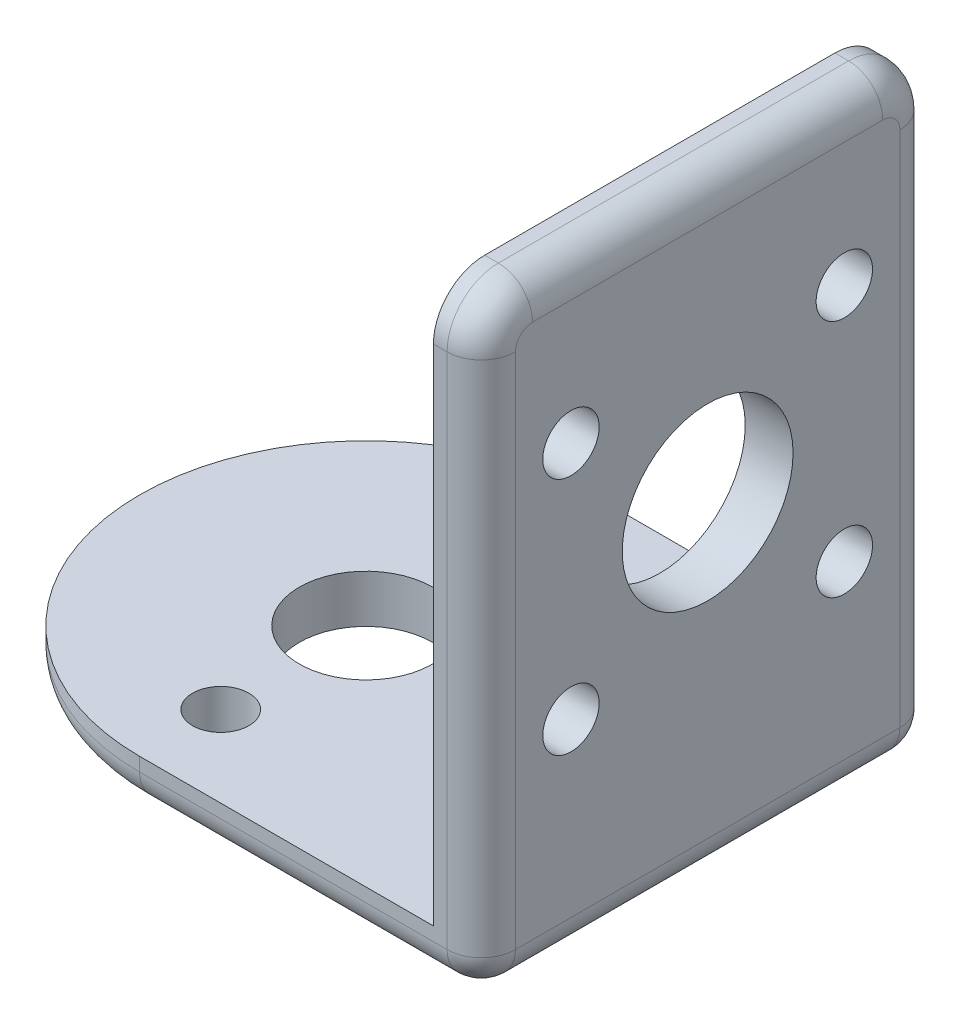
ISO-10303-21;
HEADER;
FILE_DESCRIPTION(('STEP AP214'),'2;1');
FILE_NAME('part.step','',(''),(''),'','','');
FILE_SCHEMA(('AUTOMOTIVE_DESIGN { 1 0 10303 214 1 1 1 1 }'));
ENDSEC;
DATA;
#1=APPLICATION_CONTEXT('core data for automotive mechanical design processes');
#2=APPLICATION_PROTOCOL_DEFINITION('international standard','automotive_design',2000,#1);
#3=PRODUCT_CONTEXT('',#1,'mechanical');
#4=PRODUCT('Part','Part','',(#3));
#5=PRODUCT_RELATED_PRODUCT_CATEGORY('part','',(#4));
#6=PRODUCT_DEFINITION_FORMATION('','',#4);
#7=PRODUCT_DEFINITION_CONTEXT('part definition',#1,'design');
#8=PRODUCT_DEFINITION('design','',#6,#7);
#9=PRODUCT_DEFINITION_SHAPE('','',#8);
#10=(LENGTH_UNIT() NAMED_UNIT(*) SI_UNIT(.MILLI.,.METRE.));
#11=(NAMED_UNIT(*) PLANE_ANGLE_UNIT() SI_UNIT($,.RADIAN.));
#12=(NAMED_UNIT(*) SI_UNIT($,.STERADIAN.) SOLID_ANGLE_UNIT());
#13=UNCERTAINTY_MEASURE_WITH_UNIT(LENGTH_MEASURE(1.E-05),#10,'distance_accuracy_value','');
#14=(GEOMETRIC_REPRESENTATION_CONTEXT(3) GLOBAL_UNCERTAINTY_ASSIGNED_CONTEXT((#13)) GLOBAL_UNIT_ASSIGNED_CONTEXT((#10,
#11,#12)) REPRESENTATION_CONTEXT('',''));
#15=CARTESIAN_POINT('',(0.,0.,0.));
#16=DIRECTION('',(0.,0.,1.));
#17=DIRECTION('',(1.,0.,0.));
#18=AXIS2_PLACEMENT_3D('',#15,#16,#17);
#19=CARTESIAN_POINT('',(2.8,0.,0.));
#20=DIRECTION('',(1.,0.,0.));
#21=DIRECTION('',(0.,0.,-1.));
#22=AXIS2_PLACEMENT_3D('',#19,#20,#21);
#23=PLANE('',#22);
#24=DIRECTION('',(0.,0.,1.));
#25=VECTOR('',#24,1.);
#26=CARTESIAN_POINT('',(2.8,-33.3,0.));
#27=LINE('',#26,#25);
#28=CARTESIAN_POINT('',(2.8,-33.3,-2.));
#29=VERTEX_POINT('',#28);
#30=CARTESIAN_POINT('',(2.8,-33.3,-24.5));
#31=VERTEX_POINT('',#30);
#32=EDGE_CURVE('E224',#29,#31,#27,.F.);
#33=ORIENTED_EDGE('',*,*,#32,.T.);
#34=DIRECTION('',(0.,1.,0.));
#35=VECTOR('',#34,1.);
#36=CARTESIAN_POINT('',(2.8,-3.,-24.5));
#37=LINE('',#36,#35);
#38=CARTESIAN_POINT('',(2.8,-3.,-24.5));
#39=VERTEX_POINT('',#38);
#40=EDGE_CURVE('E236',#31,#39,#37,.T.);
#41=ORIENTED_EDGE('',*,*,#40,.T.);
#42=CARTESIAN_POINT('',(2.8,-3.,-23.5));
#43=DIRECTION('',(1.,0.,0.));
#44=DIRECTION('',(0.,0.,-1.));
#45=AXIS2_PLACEMENT_3D('',#42,#43,#44);
#46=CIRCLE('',#45,1.);
#47=CARTESIAN_POINT('',(2.8,-2.,-23.5));
#48=VERTEX_POINT('',#47);
#49=EDGE_CURVE('E231',#39,#48,#46,.T.);
#50=ORIENTED_EDGE('',*,*,#49,.T.);
#51=DIRECTION('',(0.,0.,1.));
#52=VECTOR('',#51,1.);
#53=CARTESIAN_POINT('',(2.8,-2.,-3.));
#54=LINE('',#53,#52);
#55=CARTESIAN_POINT('',(2.8,-2.,-3.));
#56=VERTEX_POINT('',#55);
#57=EDGE_CURVE('E227',#48,#56,#54,.T.);
#58=ORIENTED_EDGE('',*,*,#57,.T.);
#59=CARTESIAN_POINT('',(2.8,-3.,-3.));
#60=DIRECTION('',(1.,0.,0.));
#61=DIRECTION('',(0.,0.,-1.));
#62=AXIS2_PLACEMENT_3D('',#59,#60,#61);
#63=CIRCLE('',#62,1.);
#64=CARTESIAN_POINT('',(2.8,-3.,-2.));
#65=VERTEX_POINT('',#64);
#66=EDGE_CURVE('E229',#56,#65,#63,.T.);
#67=ORIENTED_EDGE('',*,*,#66,.T.);
#68=DIRECTION('',(0.,-1.,0.));
#69=VECTOR('',#68,1.);
#70=CARTESIAN_POINT('',(2.8,-33.3,-2.));
#71=LINE('',#70,#69);
#72=EDGE_CURVE('E234',#65,#29,#71,.T.);
#73=ORIENTED_EDGE('',*,*,#72,.T.);
#74=EDGE_LOOP('',(#33,#41,#50,#58,#67,#73));
#75=FACE_BOUND('',#74,.T.);
#76=CARTESIAN_POINT('',(2.8,-23.25,-5.25));
#77=DIRECTION('',(1.,0.,0.));
#78=DIRECTION('',(0.,0.,-1.));
#79=AXIS2_PLACEMENT_3D('',#76,#77,#78);
#80=CIRCLE('',#79,1.65);
#81=CARTESIAN_POINT('',(2.8,-23.25,-6.9));
#82=VERTEX_POINT('',#81);
#83=EDGE_CURVE('E174',#82,#82,#80,.T.);
#84=ORIENTED_EDGE('',*,*,#83,.F.);
#85=EDGE_LOOP('',(#84));
#86=FACE_BOUND('',#85,.T.);
#87=CARTESIAN_POINT('',(2.8,-9.25,-5.25));
#88=DIRECTION('',(1.,0.,0.));
#89=DIRECTION('',(0.,0.,-1.));
#90=AXIS2_PLACEMENT_3D('',#87,#88,#89);
#91=CIRCLE('',#90,1.65);
#92=CARTESIAN_POINT('',(2.8,-9.25,-6.9));
#93=VERTEX_POINT('',#92);
#94=EDGE_CURVE('E186',#93,#93,#91,.T.);
#95=ORIENTED_EDGE('',*,*,#94,.F.);
#96=EDGE_LOOP('',(#95));
#97=FACE_BOUND('',#96,.T.);
#98=CARTESIAN_POINT('',(2.8,-16.25,-13.25));
#99=DIRECTION('',(1.,0.,0.));
#100=DIRECTION('',(0.,0.,-1.));
#101=AXIS2_PLACEMENT_3D('',#98,#99,#100);
#102=CIRCLE('',#101,5.);
#103=CARTESIAN_POINT('',(2.8,-16.25,-18.25));
#104=VERTEX_POINT('',#103);
#105=EDGE_CURVE('E192',#104,#104,#102,.T.);
#106=ORIENTED_EDGE('',*,*,#105,.F.);
#107=EDGE_LOOP('',(#106));
#108=FACE_BOUND('',#107,.T.);
#109=CARTESIAN_POINT('',(2.8,-9.25,-21.25));
#110=DIRECTION('',(1.,0.,0.));
#111=DIRECTION('',(0.,0.,-1.));
#112=AXIS2_PLACEMENT_3D('',#109,#110,#111);
#113=CIRCLE('',#112,1.65);
#114=CARTESIAN_POINT('',(2.8,-9.25,-22.9));
#115=VERTEX_POINT('',#114);
#116=EDGE_CURVE('E180',#115,#115,#113,.T.);
#117=ORIENTED_EDGE('',*,*,#116,.F.);
#118=EDGE_LOOP('',(#117));
#119=FACE_BOUND('',#118,.T.);
#120=CARTESIAN_POINT('',(2.8,-23.25,-21.25));
#121=DIRECTION('',(1.,0.,0.));
#122=DIRECTION('',(0.,0.,-1.));
#123=AXIS2_PLACEMENT_3D('',#120,#121,#122);
#124=CIRCLE('',#123,1.65);
#125=CARTESIAN_POINT('',(2.8,-23.25,-22.9));
#126=VERTEX_POINT('',#125);
#127=EDGE_CURVE('E168',#126,#126,#124,.T.);
#128=ORIENTED_EDGE('',*,*,#127,.F.);
#129=EDGE_LOOP('',(#128));
#130=FACE_BOUND('',#129,.T.);
#131=ADVANCED_FACE('F37',(#75,#86,#97,#108,#119,#130),#23,.T.);
#132=CARTESIAN_POINT('',(0.,0.,0.));
#133=DIRECTION('',(1.,0.,0.));
#134=DIRECTION('',(0.,0.,-1.));
#135=AXIS2_PLACEMENT_3D('',#132,#133,#134);
#136=PLANE('',#135);
#137=CARTESIAN_POINT('',(0.,-23.25,-5.25));
#138=DIRECTION('',(1.,0.,0.));
#139=DIRECTION('',(0.,0.,-1.));
#140=AXIS2_PLACEMENT_3D('',#137,#138,#139);
#141=CIRCLE('',#140,1.65);
#142=CARTESIAN_POINT('',(0.,-23.25,-6.9));
#143=VERTEX_POINT('',#142);
#144=EDGE_CURVE('E171',#143,#143,#141,.T.);
#145=ORIENTED_EDGE('',*,*,#144,.T.);
#146=EDGE_LOOP('',(#145));
#147=FACE_BOUND('',#146,.T.);
#148=CARTESIAN_POINT('',(0.,-9.25,-5.25));
#149=DIRECTION('',(1.,0.,0.));
#150=DIRECTION('',(0.,0.,-1.));
#151=AXIS2_PLACEMENT_3D('',#148,#149,#150);
#152=CIRCLE('',#151,1.65);
#153=CARTESIAN_POINT('',(0.,-9.25,-6.9));
#154=VERTEX_POINT('',#153);
#155=EDGE_CURVE('E183',#154,#154,#152,.T.);
#156=ORIENTED_EDGE('',*,*,#155,.T.);
#157=EDGE_LOOP('',(#156));
#158=FACE_BOUND('',#157,.T.);
#159=DIRECTION('',(0.,-1.,0.));
#160=VECTOR('',#159,1.);
#161=CARTESIAN_POINT('',(0.,0.,0.));
#162=LINE('',#161,#160);
#163=CARTESIAN_POINT('',(0.,-3.,0.));
#164=VERTEX_POINT('',#163);
#165=CARTESIAN_POINT('',(0.,-32.5,0.));
#166=VERTEX_POINT('',#165);
#167=EDGE_CURVE('E150',#164,#166,#162,.T.);
#168=ORIENTED_EDGE('',*,*,#167,.F.);
#169=CARTESIAN_POINT('',(0.,-3.,-3.));
#170=DIRECTION('',(1.,0.,0.));
#171=DIRECTION('',(0.,0.,-1.));
#172=AXIS2_PLACEMENT_3D('',#169,#170,#171);
#173=CIRCLE('',#172,3.);
#174=CARTESIAN_POINT('',(0.,0.,-3.));
#175=VERTEX_POINT('',#174);
#176=EDGE_CURVE('E217',#164,#175,#173,.F.);
#177=ORIENTED_EDGE('',*,*,#176,.T.);
#178=DIRECTION('',(0.,0.,1.));
#179=VECTOR('',#178,1.);
#180=CARTESIAN_POINT('',(0.,0.,0.));
#181=LINE('',#180,#179);
#182=CARTESIAN_POINT('',(0.,0.,-23.5));
#183=VERTEX_POINT('',#182);
#184=EDGE_CURVE('E199',#183,#175,#181,.T.);
#185=ORIENTED_EDGE('',*,*,#184,.F.);
#186=CARTESIAN_POINT('',(0.,-3.,-23.5));
#187=DIRECTION('',(1.,0.,0.));
#188=DIRECTION('',(0.,0.,-1.));
#189=AXIS2_PLACEMENT_3D('',#186,#187,#188);
#190=CIRCLE('',#189,3.);
#191=CARTESIAN_POINT('',(0.,-3.,-26.5));
#192=VERTEX_POINT('',#191);
#193=EDGE_CURVE('E434',#183,#192,#190,.F.);
#194=ORIENTED_EDGE('',*,*,#193,.T.);
#195=DIRECTION('',(0.,1.,0.));
#196=VECTOR('',#195,1.);
#197=CARTESIAN_POINT('',(0.,0.,-26.5));
#198=LINE('',#197,#196);
#199=CARTESIAN_POINT('',(0.,-32.5,-26.5));
#200=VERTEX_POINT('',#199);
#201=EDGE_CURVE('E205',#200,#192,#198,.T.);
#202=ORIENTED_EDGE('',*,*,#201,.F.);
#203=DIRECTION('',(0.,0.,-1.));
#204=VECTOR('',#203,1.);
#205=CARTESIAN_POINT('',(0.,-32.5,0.));
#206=LINE('',#205,#204);
#207=EDGE_CURVE('E202',#166,#200,#206,.T.);
#208=ORIENTED_EDGE('',*,*,#207,.F.);
#209=EDGE_LOOP('',(#168,#177,#185,#194,#202,#208));
#210=FACE_BOUND('',#209,.T.);
#211=CARTESIAN_POINT('',(0.,-16.25,-13.25));
#212=DIRECTION('',(1.,0.,0.));
#213=DIRECTION('',(0.,0.,-1.));
#214=AXIS2_PLACEMENT_3D('',#211,#212,#213);
#215=CIRCLE('',#214,5.);
#216=CARTESIAN_POINT('',(0.,-16.25,-18.25));
#217=VERTEX_POINT('',#216);
#218=EDGE_CURVE('E189',#217,#217,#215,.T.);
#219=ORIENTED_EDGE('',*,*,#218,.T.);
#220=EDGE_LOOP('',(#219));
#221=FACE_BOUND('',#220,.T.);
#222=CARTESIAN_POINT('',(0.,-9.25,-21.25));
#223=DIRECTION('',(1.,0.,0.));
#224=DIRECTION('',(0.,0.,-1.));
#225=AXIS2_PLACEMENT_3D('',#222,#223,#224);
#226=CIRCLE('',#225,1.65);
#227=CARTESIAN_POINT('',(0.,-9.25,-22.9));
#228=VERTEX_POINT('',#227);
#229=EDGE_CURVE('E177',#228,#228,#226,.T.);
#230=ORIENTED_EDGE('',*,*,#229,.T.);
#231=EDGE_LOOP('',(#230));
#232=FACE_BOUND('',#231,.T.);
#233=CARTESIAN_POINT('',(0.,-23.25,-21.25));
#234=DIRECTION('',(1.,0.,0.));
#235=DIRECTION('',(0.,0.,-1.));
#236=AXIS2_PLACEMENT_3D('',#233,#234,#235);
#237=CIRCLE('',#236,1.65);
#238=CARTESIAN_POINT('',(0.,-23.25,-22.9));
#239=VERTEX_POINT('',#238);
#240=EDGE_CURVE('E143',#239,#239,#237,.T.);
#241=ORIENTED_EDGE('',*,*,#240,.T.);
#242=EDGE_LOOP('',(#241));
#243=FACE_BOUND('',#242,.T.);
#244=ADVANCED_FACE('F328',(#147,#158,#210,#221,#232,#243),#136,.F.);
#245=CARTESIAN_POINT('',(2.8,0.,0.));
#246=DIRECTION('',(0.,0.,-1.));
#247=DIRECTION('',(0.,1.,0.));
#248=AXIS2_PLACEMENT_3D('',#245,#246,#247);
#249=PLANE('',#248);
#250=DIRECTION('',(0.,1.,0.));
#251=VECTOR('',#250,1.);
#252=CARTESIAN_POINT('',(-17.2,-35.3,0.));
#253=LINE('',#252,#251);
#254=CARTESIAN_POINT('',(-17.2,-33.3,0.));
#255=VERTEX_POINT('',#254);
#256=CARTESIAN_POINT('',(-17.2,-32.5,0.));
#257=VERTEX_POINT('',#256);
#258=EDGE_CURVE('E134',#255,#257,#253,.T.);
#259=ORIENTED_EDGE('',*,*,#258,.F.);
#260=DIRECTION('',(-1.,0.,0.));
#261=VECTOR('',#260,1.);
#262=CARTESIAN_POINT('',(0.799999999999999,-33.3,0.));
#263=LINE('',#262,#261);
#264=CARTESIAN_POINT('',(0.8,-33.3,0.));
#265=VERTEX_POINT('',#264);
#266=EDGE_CURVE('E61',#255,#265,#263,.F.);
#267=ORIENTED_EDGE('',*,*,#266,.T.);
#268=DIRECTION('',(0.,-1.,0.));
#269=VECTOR('',#268,1.);
#270=CARTESIAN_POINT('',(0.8,-3.,0.));
#271=LINE('',#270,#269);
#272=CARTESIAN_POINT('',(0.8,-3.,0.));
#273=VERTEX_POINT('',#272);
#274=EDGE_CURVE('E256',#265,#273,#271,.F.);
#275=ORIENTED_EDGE('',*,*,#274,.T.);
#276=DIRECTION('',(-1.,0.,0.));
#277=VECTOR('',#276,1.);
#278=CARTESIAN_POINT('',(2.8,-3.,0.));
#279=LINE('',#278,#277);
#280=EDGE_CURVE('E215',#273,#164,#279,.T.);
#281=ORIENTED_EDGE('',*,*,#280,.T.);
#282=ORIENTED_EDGE('',*,*,#167,.T.);
#283=DIRECTION('',(-1.,0.,0.));
#284=VECTOR('',#283,1.);
#285=CARTESIAN_POINT('',(2.8,-32.5,0.));
#286=LINE('',#285,#284);
#287=EDGE_CURVE('E147',#166,#257,#286,.T.);
#288=ORIENTED_EDGE('',*,*,#287,.T.);
#289=EDGE_LOOP('',(#259,#267,#275,#281,#282,#288));
#290=FACE_BOUND('',#289,.T.);
#291=ADVANCED_FACE('F148',(#290),#249,.F.);
#292=CARTESIAN_POINT('',(2.8,0.,-26.5));
#293=DIRECTION('',(0.,0.,1.));
#294=DIRECTION('',(0.,-1.,0.));
#295=AXIS2_PLACEMENT_3D('',#292,#293,#294);
#296=PLANE('',#295);
#297=DIRECTION('',(0.,1.,0.));
#298=VECTOR('',#297,1.);
#299=CARTESIAN_POINT('',(0.8,-33.3,-26.5));
#300=LINE('',#299,#298);
#301=CARTESIAN_POINT('',(0.8,-3.,-26.5));
#302=VERTEX_POINT('',#301);
#303=CARTESIAN_POINT('',(0.8,-33.3,-26.5));
#304=VERTEX_POINT('',#303);
#305=EDGE_CURVE('E251',#302,#304,#300,.F.);
#306=ORIENTED_EDGE('',*,*,#305,.T.);
#307=DIRECTION('',(1.,0.,0.));
#308=VECTOR('',#307,1.);
#309=CARTESIAN_POINT('',(-17.2,-33.3,-26.5));
#310=LINE('',#309,#308);
#311=CARTESIAN_POINT('',(-17.2,-33.3,-26.5));
#312=VERTEX_POINT('',#311);
#313=EDGE_CURVE('E253',#304,#312,#310,.F.);
#314=ORIENTED_EDGE('',*,*,#313,.T.);
#315=DIRECTION('',(0.,1.,0.));
#316=VECTOR('',#315,1.);
#317=CARTESIAN_POINT('',(-17.2,-35.3,-26.5));
#318=LINE('',#317,#316);
#319=CARTESIAN_POINT('',(-17.2,-32.5,-26.5));
#320=VERTEX_POINT('',#319);
#321=EDGE_CURVE('E144',#312,#320,#318,.T.);
#322=ORIENTED_EDGE('',*,*,#321,.T.);
#323=DIRECTION('',(1.,0.,0.));
#324=VECTOR('',#323,1.);
#325=CARTESIAN_POINT('',(2.8,-32.5,-26.5));
#326=LINE('',#325,#324);
#327=EDGE_CURVE('E158',#320,#200,#326,.T.);
#328=ORIENTED_EDGE('',*,*,#327,.T.);
#329=ORIENTED_EDGE('',*,*,#201,.T.);
#330=DIRECTION('',(-1.,0.,0.));
#331=VECTOR('',#330,1.);
#332=CARTESIAN_POINT('',(2.8,-3.,-26.5));
#333=LINE('',#332,#331);
#334=EDGE_CURVE('E214',#192,#302,#333,.F.);
#335=ORIENTED_EDGE('',*,*,#334,.T.);
#336=EDGE_LOOP('',(#306,#314,#322,#328,#329,#335));
#337=FACE_BOUND('',#336,.T.);
#338=ADVANCED_FACE('F344',(#337),#296,.F.);
#339=CARTESIAN_POINT('',(2.8,0.,0.));
#340=DIRECTION('',(0.,-1.,0.));
#341=DIRECTION('',(0.,0.,-1.));
#342=AXIS2_PLACEMENT_3D('',#339,#340,#341);
#343=PLANE('',#342);
#344=DIRECTION('',(-1.,0.,0.));
#345=VECTOR('',#344,1.);
#346=CARTESIAN_POINT('',(2.8,0.,-3.));
#347=LINE('',#346,#345);
#348=CARTESIAN_POINT('',(0.8,0.,-3.));
#349=VERTEX_POINT('',#348);
#350=EDGE_CURVE('E219',#175,#349,#347,.F.);
#351=ORIENTED_EDGE('',*,*,#350,.T.);
#352=DIRECTION('',(0.,0.,1.));
#353=VECTOR('',#352,1.);
#354=CARTESIAN_POINT('',(0.8,0.,-23.5));
#355=LINE('',#354,#353);
#356=CARTESIAN_POINT('',(0.8,0.,-23.5));
#357=VERTEX_POINT('',#356);
#358=EDGE_CURVE('E11',#349,#357,#355,.F.);
#359=ORIENTED_EDGE('',*,*,#358,.T.);
#360=DIRECTION('',(-1.,0.,0.));
#361=VECTOR('',#360,1.);
#362=CARTESIAN_POINT('',(2.8,0.,-23.5));
#363=LINE('',#362,#361);
#364=EDGE_CURVE('E209',#357,#183,#363,.T.);
#365=ORIENTED_EDGE('',*,*,#364,.T.);
#366=ORIENTED_EDGE('',*,*,#184,.T.);
#367=EDGE_LOOP('',(#351,#359,#365,#366));
#368=FACE_BOUND('',#367,.T.);
#369=ADVANCED_FACE('F341',(#368),#343,.F.);
#370=CARTESIAN_POINT('',(2.8,-16.25,-13.25));
#371=DIRECTION('',(-1.,0.,0.));
#372=DIRECTION('',(0.,0.,1.));
#373=AXIS2_PLACEMENT_3D('',#370,#371,#372);
#374=CYLINDRICAL_SURFACE('',#373,5.);
#375=ORIENTED_EDGE('',*,*,#105,.T.);
#376=EDGE_LOOP('',(#375));
#377=FACE_BOUND('',#376,.T.);
#378=ORIENTED_EDGE('',*,*,#218,.F.);
#379=EDGE_LOOP('',(#378));
#380=FACE_BOUND('',#379,.T.);
#381=ADVANCED_FACE('F338',(#377,#380),#374,.F.);
#382=CARTESIAN_POINT('',(2.8,-9.25,-5.25));
#383=DIRECTION('',(-1.,0.,0.));
#384=DIRECTION('',(0.,0.,1.));
#385=AXIS2_PLACEMENT_3D('',#382,#383,#384);
#386=CYLINDRICAL_SURFACE('',#385,1.65);
#387=ORIENTED_EDGE('',*,*,#94,.T.);
#388=EDGE_LOOP('',(#387));
#389=FACE_BOUND('',#388,.T.);
#390=ORIENTED_EDGE('',*,*,#155,.F.);
#391=EDGE_LOOP('',(#390));
#392=FACE_BOUND('',#391,.T.);
#393=ADVANCED_FACE('F611',(#389,#392),#386,.F.);
#394=CARTESIAN_POINT('',(2.8,-9.25,-21.25));
#395=DIRECTION('',(-1.,0.,0.));
#396=DIRECTION('',(0.,0.,1.));
#397=AXIS2_PLACEMENT_3D('',#394,#395,#396);
#398=CYLINDRICAL_SURFACE('',#397,1.65);
#399=ORIENTED_EDGE('',*,*,#116,.T.);
#400=EDGE_LOOP('',(#399));
#401=FACE_BOUND('',#400,.T.);
#402=ORIENTED_EDGE('',*,*,#229,.F.);
#403=EDGE_LOOP('',(#402));
#404=FACE_BOUND('',#403,.T.);
#405=ADVANCED_FACE('F602',(#401,#404),#398,.F.);
#406=CARTESIAN_POINT('',(2.8,-23.25,-5.25));
#407=DIRECTION('',(-1.,0.,0.));
#408=DIRECTION('',(0.,0.,1.));
#409=AXIS2_PLACEMENT_3D('',#406,#407,#408);
#410=CYLINDRICAL_SURFACE('',#409,1.65);
#411=ORIENTED_EDGE('',*,*,#83,.T.);
#412=EDGE_LOOP('',(#411));
#413=FACE_BOUND('',#412,.T.);
#414=ORIENTED_EDGE('',*,*,#144,.F.);
#415=EDGE_LOOP('',(#414));
#416=FACE_BOUND('',#415,.T.);
#417=ADVANCED_FACE('F593',(#413,#416),#410,.F.);
#418=CARTESIAN_POINT('',(2.8,-23.25,-21.25));
#419=DIRECTION('',(-1.,0.,0.));
#420=DIRECTION('',(0.,0.,1.));
#421=AXIS2_PLACEMENT_3D('',#418,#419,#420);
#422=CYLINDRICAL_SURFACE('',#421,1.65);
#423=ORIENTED_EDGE('',*,*,#127,.T.);
#424=EDGE_LOOP('',(#423));
#425=FACE_BOUND('',#424,.T.);
#426=ORIENTED_EDGE('',*,*,#240,.F.);
#427=EDGE_LOOP('',(#426));
#428=FACE_BOUND('',#427,.T.);
#429=ADVANCED_FACE('F560',(#425,#428),#422,.F.);
#430=CARTESIAN_POINT('',(-17.2,-32.5,-13.25));
#431=DIRECTION('',(0.,-1.,0.));
#432=DIRECTION('',(0.,0.,-1.));
#433=AXIS2_PLACEMENT_3D('',#430,#431,#432);
#434=PLANE('',#433);
#435=CARTESIAN_POINT('',(-17.2,-32.5,-21.75));
#436=DIRECTION('',(0.,-1.,0.));
#437=DIRECTION('',(0.,0.,1.));
#438=AXIS2_PLACEMENT_3D('',#435,#436,#437);
#439=CIRCLE('',#438,1.65);
#440=CARTESIAN_POINT('',(-17.2,-32.5,-20.1));
#441=VERTEX_POINT('',#440);
#442=EDGE_CURVE('E287',#441,#441,#439,.T.);
#443=ORIENTED_EDGE('',*,*,#442,.T.);
#444=EDGE_LOOP('',(#443));
#445=FACE_BOUND('',#444,.T.);
#446=CARTESIAN_POINT('',(-17.2,-32.5,-13.25));
#447=DIRECTION('',(0.,-1.,0.));
#448=DIRECTION('',(0.,0.,-1.));
#449=AXIS2_PLACEMENT_3D('',#446,#447,#448);
#450=CIRCLE('',#449,3.9);
#451=CARTESIAN_POINT('',(-17.2,-32.5,-17.15));
#452=VERTEX_POINT('',#451);
#453=EDGE_CURVE('E303',#452,#452,#450,.T.);
#454=ORIENTED_EDGE('',*,*,#453,.T.);
#455=EDGE_LOOP('',(#454));
#456=FACE_BOUND('',#455,.T.);
#457=CARTESIAN_POINT('',(-17.2,-32.5,-4.75));
#458=DIRECTION('',(0.,-1.,0.));
#459=DIRECTION('',(0.,0.,-1.));
#460=AXIS2_PLACEMENT_3D('',#457,#458,#459);
#461=CIRCLE('',#460,1.65);
#462=CARTESIAN_POINT('',(-17.2,-32.5,-6.4));
#463=VERTEX_POINT('',#462);
#464=EDGE_CURVE('E297',#463,#463,#461,.T.);
#465=ORIENTED_EDGE('',*,*,#464,.T.);
#466=EDGE_LOOP('',(#465));
#467=FACE_BOUND('',#466,.T.);
#468=ORIENTED_EDGE('',*,*,#287,.F.);
#469=ORIENTED_EDGE('',*,*,#207,.T.);
#470=ORIENTED_EDGE('',*,*,#327,.F.);
#471=CARTESIAN_POINT('',(-17.2,-32.5,-13.25));
#472=DIRECTION('',(0.,-1.,0.));
#473=DIRECTION('',(0.,0.,-1.));
#474=AXIS2_PLACEMENT_3D('',#471,#472,#473);
#475=CIRCLE('',#474,13.25);
#476=EDGE_CURVE('E139',#257,#320,#475,.T.);
#477=ORIENTED_EDGE('',*,*,#476,.F.);
#478=EDGE_LOOP('',(#468,#469,#470,#477));
#479=FACE_BOUND('',#478,.T.);
#480=ADVANCED_FACE('F156',(#445,#456,#467,#479),#434,.F.);
#481=CARTESIAN_POINT('',(-17.2,-35.3,-13.25));
#482=DIRECTION('',(0.,-1.,0.));
#483=DIRECTION('',(0.,0.,-1.));
#484=AXIS2_PLACEMENT_3D('',#481,#482,#483);
#485=PLANE('',#484);
#486=CARTESIAN_POINT('',(-17.2,-35.3,-4.75));
#487=DIRECTION('',(0.,-1.,0.));
#488=DIRECTION('',(0.,0.,-1.));
#489=AXIS2_PLACEMENT_3D('',#486,#487,#488);
#490=CIRCLE('',#489,1.65);
#491=CARTESIAN_POINT('',(-17.2,-35.3,-6.4));
#492=VERTEX_POINT('',#491);
#493=EDGE_CURVE('E300',#492,#492,#490,.T.);
#494=ORIENTED_EDGE('',*,*,#493,.F.);
#495=EDGE_LOOP('',(#494));
#496=FACE_BOUND('',#495,.T.);
#497=CARTESIAN_POINT('',(-17.2,-35.3,-13.25));
#498=DIRECTION('',(0.,-1.,0.));
#499=DIRECTION('',(0.,0.,-1.));
#500=AXIS2_PLACEMENT_3D('',#497,#498,#499);
#501=CIRCLE('',#500,11.25);
#502=CARTESIAN_POINT('',(-17.2,-35.3,-2.));
#503=VERTEX_POINT('',#502);
#504=CARTESIAN_POINT('',(-17.2,-35.3,-24.5));
#505=VERTEX_POINT('',#504);
#506=EDGE_CURVE('E247',#503,#505,#501,.T.);
#507=ORIENTED_EDGE('',*,*,#506,.T.);
#508=DIRECTION('',(1.,0.,0.));
#509=VECTOR('',#508,1.);
#510=CARTESIAN_POINT('',(0.799999999999999,-35.3,-24.5));
#511=LINE('',#510,#509);
#512=CARTESIAN_POINT('',(0.799999999999999,-35.3,-24.5));
#513=VERTEX_POINT('',#512);
#514=EDGE_CURVE('E249',#505,#513,#511,.T.);
#515=ORIENTED_EDGE('',*,*,#514,.T.);
#516=DIRECTION('',(0.,0.,1.));
#517=VECTOR('',#516,1.);
#518=CARTESIAN_POINT('',(0.799999999999999,-35.3,-13.25));
#519=LINE('',#518,#517);
#520=CARTESIAN_POINT('',(0.799999999999999,-35.3,-2.));
#521=VERTEX_POINT('',#520);
#522=EDGE_CURVE('E221',#513,#521,#519,.T.);
#523=ORIENTED_EDGE('',*,*,#522,.T.);
#524=DIRECTION('',(-1.,0.,0.));
#525=VECTOR('',#524,1.);
#526=CARTESIAN_POINT('',(-17.2,-35.3,-2.));
#527=LINE('',#526,#525);
#528=EDGE_CURVE('E245',#521,#503,#527,.T.);
#529=ORIENTED_EDGE('',*,*,#528,.T.);
#530=EDGE_LOOP('',(#507,#515,#523,#529));
#531=FACE_BOUND('',#530,.T.);
#532=CARTESIAN_POINT('',(-17.2,-35.3,-13.25));
#533=DIRECTION('',(0.,-1.,0.));
#534=DIRECTION('',(0.,0.,-1.));
#535=AXIS2_PLACEMENT_3D('',#532,#533,#534);
#536=CIRCLE('',#535,3.9);
#537=CARTESIAN_POINT('',(-17.2,-35.3,-17.15));
#538=VERTEX_POINT('',#537);
#539=EDGE_CURVE('E154',#538,#538,#536,.T.);
#540=ORIENTED_EDGE('',*,*,#539,.F.);
#541=EDGE_LOOP('',(#540));
#542=FACE_BOUND('',#541,.T.);
#543=CARTESIAN_POINT('',(-17.2,-35.3,-21.75));
#544=DIRECTION('',(0.,-1.,0.));
#545=DIRECTION('',(0.,0.,1.));
#546=AXIS2_PLACEMENT_3D('',#543,#544,#545);
#547=CIRCLE('',#546,1.65);
#548=CARTESIAN_POINT('',(-17.2,-35.3,-20.1));
#549=VERTEX_POINT('',#548);
#550=EDGE_CURVE('E292',#549,#549,#547,.T.);
#551=ORIENTED_EDGE('',*,*,#550,.F.);
#552=EDGE_LOOP('',(#551));
#553=FACE_BOUND('',#552,.T.);
#554=ADVANCED_FACE('F324',(#496,#531,#542,#553),#485,.T.);
#555=CARTESIAN_POINT('',(-17.2,-35.3,-13.25));
#556=DIRECTION('',(0.,1.,0.));
#557=DIRECTION('',(0.,0.,1.));
#558=AXIS2_PLACEMENT_3D('',#555,#556,#557);
#559=CYLINDRICAL_SURFACE('',#558,13.25);
#560=ORIENTED_EDGE('',*,*,#321,.F.);
#561=CARTESIAN_POINT('',(-17.2,-33.3,-13.25));
#562=DIRECTION('',(0.,-1.,0.));
#563=DIRECTION('',(0.,0.,-1.));
#564=AXIS2_PLACEMENT_3D('',#561,#562,#563);
#565=CIRCLE('',#564,13.25);
#566=EDGE_CURVE('E142',#312,#255,#565,.F.);
#567=ORIENTED_EDGE('',*,*,#566,.T.);
#568=ORIENTED_EDGE('',*,*,#258,.T.);
#569=ORIENTED_EDGE('',*,*,#476,.T.);
#570=EDGE_LOOP('',(#560,#567,#568,#569));
#571=FACE_BOUND('',#570,.T.);
#572=ADVANCED_FACE('F137',(#571),#559,.T.);
#573=CARTESIAN_POINT('',(-17.2,-35.3,-13.25));
#574=DIRECTION('',(0.,1.,0.));
#575=DIRECTION('',(0.,0.,1.));
#576=AXIS2_PLACEMENT_3D('',#573,#574,#575);
#577=CYLINDRICAL_SURFACE('',#576,3.9);
#578=ORIENTED_EDGE('',*,*,#539,.T.);
#579=EDGE_LOOP('',(#578));
#580=FACE_BOUND('',#579,.T.);
#581=ORIENTED_EDGE('',*,*,#453,.F.);
#582=EDGE_LOOP('',(#581));
#583=FACE_BOUND('',#582,.T.);
#584=ADVANCED_FACE('F312',(#580,#583),#577,.F.);
#585=CARTESIAN_POINT('',(-17.2,-35.3,-4.75));
#586=DIRECTION('',(0.,1.,0.));
#587=DIRECTION('',(0.,0.,1.));
#588=AXIS2_PLACEMENT_3D('',#585,#586,#587);
#589=CYLINDRICAL_SURFACE('',#588,1.65);
#590=ORIENTED_EDGE('',*,*,#493,.T.);
#591=EDGE_LOOP('',(#590));
#592=FACE_BOUND('',#591,.T.);
#593=ORIENTED_EDGE('',*,*,#464,.F.);
#594=EDGE_LOOP('',(#593));
#595=FACE_BOUND('',#594,.T.);
#596=ADVANCED_FACE('F314',(#592,#595),#589,.F.);
#597=CARTESIAN_POINT('',(-17.2,-35.3,-21.75));
#598=DIRECTION('',(0.,1.,0.));
#599=DIRECTION('',(0.,0.,1.));
#600=AXIS2_PLACEMENT_3D('',#597,#598,#599);
#601=CYLINDRICAL_SURFACE('',#600,1.65);
#602=ORIENTED_EDGE('',*,*,#550,.T.);
#603=EDGE_LOOP('',(#602));
#604=FACE_BOUND('',#603,.T.);
#605=ORIENTED_EDGE('',*,*,#442,.F.);
#606=EDGE_LOOP('',(#605));
#607=FACE_BOUND('',#606,.T.);
#608=ADVANCED_FACE('F321',(#604,#607),#601,.F.);
#609=CARTESIAN_POINT('',(2.8,-3.,-23.5));
#610=DIRECTION('',(-1.,0.,0.));
#611=DIRECTION('',(0.,0.,1.));
#612=AXIS2_PLACEMENT_3D('',#609,#610,#611);
#613=CYLINDRICAL_SURFACE('',#612,3.);
#614=ORIENTED_EDGE('',*,*,#364,.F.);
#615=CARTESIAN_POINT('',(0.8,-3.,-23.5));
#616=DIRECTION('',(1.,0.,0.));
#617=DIRECTION('',(0.,0.,-1.));
#618=AXIS2_PLACEMENT_3D('',#615,#616,#617);
#619=CIRCLE('',#618,3.);
#620=EDGE_CURVE('E238',#357,#302,#619,.F.);
#621=ORIENTED_EDGE('',*,*,#620,.T.);
#622=ORIENTED_EDGE('',*,*,#334,.F.);
#623=ORIENTED_EDGE('',*,*,#193,.F.);
#624=EDGE_LOOP('',(#614,#621,#622,#623));
#625=FACE_BOUND('',#624,.T.);
#626=ADVANCED_FACE('F351',(#625),#613,.T.);
#627=CARTESIAN_POINT('',(2.8,-3.,-3.));
#628=DIRECTION('',(-1.,0.,0.));
#629=DIRECTION('',(0.,0.,1.));
#630=AXIS2_PLACEMENT_3D('',#627,#628,#629);
#631=CYLINDRICAL_SURFACE('',#630,3.);
#632=ORIENTED_EDGE('',*,*,#280,.F.);
#633=CARTESIAN_POINT('',(0.8,-3.,-3.));
#634=DIRECTION('',(1.,0.,0.));
#635=DIRECTION('',(0.,0.,-1.));
#636=AXIS2_PLACEMENT_3D('',#633,#634,#635);
#637=CIRCLE('',#636,3.);
#638=EDGE_CURVE('E46',#273,#349,#637,.F.);
#639=ORIENTED_EDGE('',*,*,#638,.T.);
#640=ORIENTED_EDGE('',*,*,#350,.F.);
#641=ORIENTED_EDGE('',*,*,#176,.F.);
#642=EDGE_LOOP('',(#632,#639,#640,#641));
#643=FACE_BOUND('',#642,.T.);
#644=ADVANCED_FACE('F354',(#643),#631,.T.);
#645=CARTESIAN_POINT('',(0.799999999999999,-33.3,-13.25));
#646=DIRECTION('',(0.,0.,1.));
#647=DIRECTION('',(1.,0.,0.));
#648=AXIS2_PLACEMENT_3D('',#645,#646,#647);
#649=CYLINDRICAL_SURFACE('',#648,2.);
#650=ORIENTED_EDGE('',*,*,#522,.F.);
#651=CARTESIAN_POINT('',(0.799999999999999,-33.3,-24.5));
#652=DIRECTION('',(0.,0.,1.));
#653=DIRECTION('',(1.,0.,0.));
#654=AXIS2_PLACEMENT_3D('',#651,#652,#653);
#655=CIRCLE('',#654,2.);
#656=EDGE_CURVE('E243',#513,#31,#655,.T.);
#657=ORIENTED_EDGE('',*,*,#656,.T.);
#658=ORIENTED_EDGE('',*,*,#32,.F.);
#659=CARTESIAN_POINT('',(0.799999999999999,-33.3,-2.));
#660=DIRECTION('',(0.,0.,1.));
#661=DIRECTION('',(1.,0.,0.));
#662=AXIS2_PLACEMENT_3D('',#659,#660,#661);
#663=CIRCLE('',#662,2.);
#664=EDGE_CURVE('E241',#29,#521,#663,.F.);
#665=ORIENTED_EDGE('',*,*,#664,.T.);
#666=EDGE_LOOP('',(#650,#657,#658,#665));
#667=FACE_BOUND('',#666,.T.);
#668=ADVANCED_FACE('F358',(#667),#649,.T.);
#669=CARTESIAN_POINT('',(-17.2,-33.3,-2.));
#670=DIRECTION('',(1.,0.,0.));
#671=DIRECTION('',(0.,0.,-1.));
#672=AXIS2_PLACEMENT_3D('',#669,#670,#671);
#673=CYLINDRICAL_SURFACE('',#672,2.);
#674=CARTESIAN_POINT('',(0.799999999999999,-33.3,-2.));
#675=DIRECTION('',(1.,0.,0.));
#676=DIRECTION('',(0.,0.,-1.));
#677=AXIS2_PLACEMENT_3D('',#674,#675,#676);
#678=CIRCLE('',#677,2.);
#679=EDGE_CURVE('E281',#265,#521,#678,.T.);
#680=ORIENTED_EDGE('',*,*,#679,.F.);
#681=ORIENTED_EDGE('',*,*,#266,.F.);
#682=CARTESIAN_POINT('',(-17.2,-33.3,-2.));
#683=DIRECTION('',(-1.,0.,0.));
#684=DIRECTION('',(0.,0.,1.));
#685=AXIS2_PLACEMENT_3D('',#682,#683,#684);
#686=CIRCLE('',#685,2.);
#687=EDGE_CURVE('E41',#503,#255,#686,.T.);
#688=ORIENTED_EDGE('',*,*,#687,.F.);
#689=ORIENTED_EDGE('',*,*,#528,.F.);
#690=EDGE_LOOP('',(#680,#681,#688,#689));
#691=FACE_BOUND('',#690,.T.);
#692=ADVANCED_FACE('F39',(#691),#673,.T.);
#693=CARTESIAN_POINT('',(-17.2,-33.3,-13.25));
#694=DIRECTION('',(0.,-1.,0.));
#695=DIRECTION('',(0.,0.,-1.));
#696=AXIS2_PLACEMENT_3D('',#693,#694,#695);
#697=TOROIDAL_SURFACE('',#696,11.25,2.);
#698=ORIENTED_EDGE('',*,*,#687,.T.);
#699=ORIENTED_EDGE('',*,*,#566,.F.);
#700=CARTESIAN_POINT('',(-17.2,-33.3,-24.5));
#701=DIRECTION('',(1.,0.,0.));
#702=DIRECTION('',(0.,0.,-1.));
#703=AXIS2_PLACEMENT_3D('',#700,#701,#702);
#704=CIRCLE('',#703,2.);
#705=EDGE_CURVE('E279',#505,#312,#704,.T.);
#706=ORIENTED_EDGE('',*,*,#705,.F.);
#707=ORIENTED_EDGE('',*,*,#506,.F.);
#708=EDGE_LOOP('',(#698,#699,#706,#707));
#709=FACE_BOUND('',#708,.T.);
#710=ADVANCED_FACE('F392',(#709),#697,.T.);
#711=CARTESIAN_POINT('',(0.799999999999999,-33.3,-2.));
#712=DIRECTION('',(0.,0.,1.));
#713=DIRECTION('',(1.,0.,0.));
#714=AXIS2_PLACEMENT_3D('',#711,#712,#713);
#715=SPHERICAL_SURFACE('',#714,2.);
#716=ORIENTED_EDGE('',*,*,#679,.T.);
#717=ORIENTED_EDGE('',*,*,#664,.F.);
#718=CARTESIAN_POINT('',(0.799999999999999,-33.3,-2.));
#719=DIRECTION('',(0.,1.,0.));
#720=DIRECTION('',(0.,0.,1.));
#721=AXIS2_PLACEMENT_3D('',#718,#719,#720);
#722=CIRCLE('',#721,2.);
#723=EDGE_CURVE('E276',#265,#29,#722,.T.);
#724=ORIENTED_EDGE('',*,*,#723,.F.);
#725=EDGE_LOOP('',(#716,#717,#724));
#726=FACE_BOUND('',#725,.T.);
#727=ADVANCED_FACE('F389',(#726),#715,.T.);
#728=CARTESIAN_POINT('',(-17.2,-33.3,-24.5));
#729=DIRECTION('',(-1.,0.,0.));
#730=DIRECTION('',(0.,0.,1.));
#731=AXIS2_PLACEMENT_3D('',#728,#729,#730);
#732=CYLINDRICAL_SURFACE('',#731,2.);
#733=ORIENTED_EDGE('',*,*,#705,.T.);
#734=ORIENTED_EDGE('',*,*,#313,.F.);
#735=CARTESIAN_POINT('',(0.799999999999999,-33.3,-24.5));
#736=DIRECTION('',(1.,0.,0.));
#737=DIRECTION('',(0.,0.,-1.));
#738=AXIS2_PLACEMENT_3D('',#735,#736,#737);
#739=CIRCLE('',#738,2.);
#740=EDGE_CURVE('E273',#513,#304,#739,.T.);
#741=ORIENTED_EDGE('',*,*,#740,.F.);
#742=ORIENTED_EDGE('',*,*,#514,.F.);
#743=EDGE_LOOP('',(#733,#734,#741,#742));
#744=FACE_BOUND('',#743,.T.);
#745=ADVANCED_FACE('F385',(#744),#732,.T.);
#746=CARTESIAN_POINT('',(0.8,0.,-2.));
#747=DIRECTION('',(0.,1.,0.));
#748=DIRECTION('',(0.,0.,1.));
#749=AXIS2_PLACEMENT_3D('',#746,#747,#748);
#750=CYLINDRICAL_SURFACE('',#749,2.);
#751=ORIENTED_EDGE('',*,*,#723,.T.);
#752=ORIENTED_EDGE('',*,*,#72,.F.);
#753=CARTESIAN_POINT('',(0.8,-3.,-2.));
#754=DIRECTION('',(0.,1.,0.));
#755=DIRECTION('',(0.,0.,1.));
#756=AXIS2_PLACEMENT_3D('',#753,#754,#755);
#757=CIRCLE('',#756,2.);
#758=EDGE_CURVE('E270',#273,#65,#757,.T.);
#759=ORIENTED_EDGE('',*,*,#758,.F.);
#760=ORIENTED_EDGE('',*,*,#274,.F.);
#761=EDGE_LOOP('',(#751,#752,#759,#760));
#762=FACE_BOUND('',#761,.T.);
#763=ADVANCED_FACE('F381',(#762),#750,.T.);
#764=CARTESIAN_POINT('',(0.799999999999999,-33.3,-24.5));
#765=DIRECTION('',(0.,0.,1.));
#766=DIRECTION('',(1.,0.,0.));
#767=AXIS2_PLACEMENT_3D('',#764,#765,#766);
#768=SPHERICAL_SURFACE('',#767,2.);
#769=ORIENTED_EDGE('',*,*,#656,.F.);
#770=ORIENTED_EDGE('',*,*,#740,.T.);
#771=CARTESIAN_POINT('',(0.799999999999999,-33.3,-24.5));
#772=DIRECTION('',(0.,1.,0.));
#773=DIRECTION('',(0.,0.,1.));
#774=AXIS2_PLACEMENT_3D('',#771,#772,#773);
#775=CIRCLE('',#774,2.);
#776=EDGE_CURVE('E267',#31,#304,#775,.T.);
#777=ORIENTED_EDGE('',*,*,#776,.F.);
#778=EDGE_LOOP('',(#769,#770,#777));
#779=FACE_BOUND('',#778,.T.);
#780=ADVANCED_FACE('F377',(#779),#768,.T.);
#781=CARTESIAN_POINT('',(0.8,-3.,-3.));
#782=DIRECTION('',(1.,0.,0.));
#783=DIRECTION('',(0.,0.,-1.));
#784=AXIS2_PLACEMENT_3D('',#781,#782,#783);
#785=DEGENERATE_TOROIDAL_SURFACE('',#784,1.,2.,.T.);
#786=ORIENTED_EDGE('',*,*,#758,.T.);
#787=ORIENTED_EDGE('',*,*,#66,.F.);
#788=CARTESIAN_POINT('',(0.8,-2.,-3.));
#789=DIRECTION('',(0.,0.,-1.));
#790=DIRECTION('',(-1.,0.,0.));
#791=AXIS2_PLACEMENT_3D('',#788,#789,#790);
#792=CIRCLE('',#791,2.);
#793=EDGE_CURVE('E264',#349,#56,#792,.T.);
#794=ORIENTED_EDGE('',*,*,#793,.F.);
#795=ORIENTED_EDGE('',*,*,#638,.F.);
#796=EDGE_LOOP('',(#786,#787,#794,#795));
#797=FACE_BOUND('',#796,.T.);
#798=ADVANCED_FACE('F373',(#797),#785,.T.);
#799=CARTESIAN_POINT('',(0.8,0.,-24.5));
#800=DIRECTION('',(0.,-1.,0.));
#801=DIRECTION('',(0.,0.,-1.));
#802=AXIS2_PLACEMENT_3D('',#799,#800,#801);
#803=CYLINDRICAL_SURFACE('',#802,2.);
#804=ORIENTED_EDGE('',*,*,#776,.T.);
#805=ORIENTED_EDGE('',*,*,#305,.F.);
#806=CARTESIAN_POINT('',(0.8,-3.,-24.5));
#807=DIRECTION('',(0.,1.,0.));
#808=DIRECTION('',(0.,0.,1.));
#809=AXIS2_PLACEMENT_3D('',#806,#807,#808);
#810=CIRCLE('',#809,2.);
#811=EDGE_CURVE('E262',#39,#302,#810,.T.);
#812=ORIENTED_EDGE('',*,*,#811,.F.);
#813=ORIENTED_EDGE('',*,*,#40,.F.);
#814=EDGE_LOOP('',(#804,#805,#812,#813));
#815=FACE_BOUND('',#814,.T.);
#816=ADVANCED_FACE('F369',(#815),#803,.T.);
#817=CARTESIAN_POINT('',(0.8,-2.,0.));
#818=DIRECTION('',(0.,0.,-1.));
#819=DIRECTION('',(-1.,0.,0.));
#820=AXIS2_PLACEMENT_3D('',#817,#818,#819);
#821=CYLINDRICAL_SURFACE('',#820,2.);
#822=ORIENTED_EDGE('',*,*,#793,.T.);
#823=ORIENTED_EDGE('',*,*,#57,.F.);
#824=CARTESIAN_POINT('',(0.8,-2.,-23.5));
#825=DIRECTION('',(0.,0.,-1.));
#826=DIRECTION('',(-1.,0.,0.));
#827=AXIS2_PLACEMENT_3D('',#824,#825,#826);
#828=CIRCLE('',#827,2.);
#829=EDGE_CURVE('E260',#357,#48,#828,.T.);
#830=ORIENTED_EDGE('',*,*,#829,.F.);
#831=ORIENTED_EDGE('',*,*,#358,.F.);
#832=EDGE_LOOP('',(#822,#823,#830,#831));
#833=FACE_BOUND('',#832,.T.);
#834=ADVANCED_FACE('F365',(#833),#821,.T.);
#835=CARTESIAN_POINT('',(0.8,-3.,-23.5));
#836=DIRECTION('',(1.,0.,0.));
#837=DIRECTION('',(0.,0.,-1.));
#838=AXIS2_PLACEMENT_3D('',#835,#836,#837);
#839=DEGENERATE_TOROIDAL_SURFACE('',#838,1.,2.,.T.);
#840=ORIENTED_EDGE('',*,*,#811,.T.);
#841=ORIENTED_EDGE('',*,*,#620,.F.);
#842=ORIENTED_EDGE('',*,*,#829,.T.);
#843=ORIENTED_EDGE('',*,*,#49,.F.);
#844=EDGE_LOOP('',(#840,#841,#842,#843));
#845=FACE_BOUND('',#844,.T.);
#846=ADVANCED_FACE('F362',(#845),#839,.T.);
#847=CLOSED_SHELL('',(#131,#244,#291,#338,#369,#381,#393,#405,#417,#429,#480,#554,#572,#584,
#596,#608,#626,#644,#668,#692,#710,#727,#745,#763,#780,#798,#816,#834,#846));
#848=MANIFOLD_SOLID_BREP('B2',#847);
#849=ADVANCED_BREP_SHAPE_REPRESENTATION('',(#18,#848),#14);
#850=SHAPE_DEFINITION_REPRESENTATION(#9,#849);
ENDSEC;
END-ISO-10303-21;
